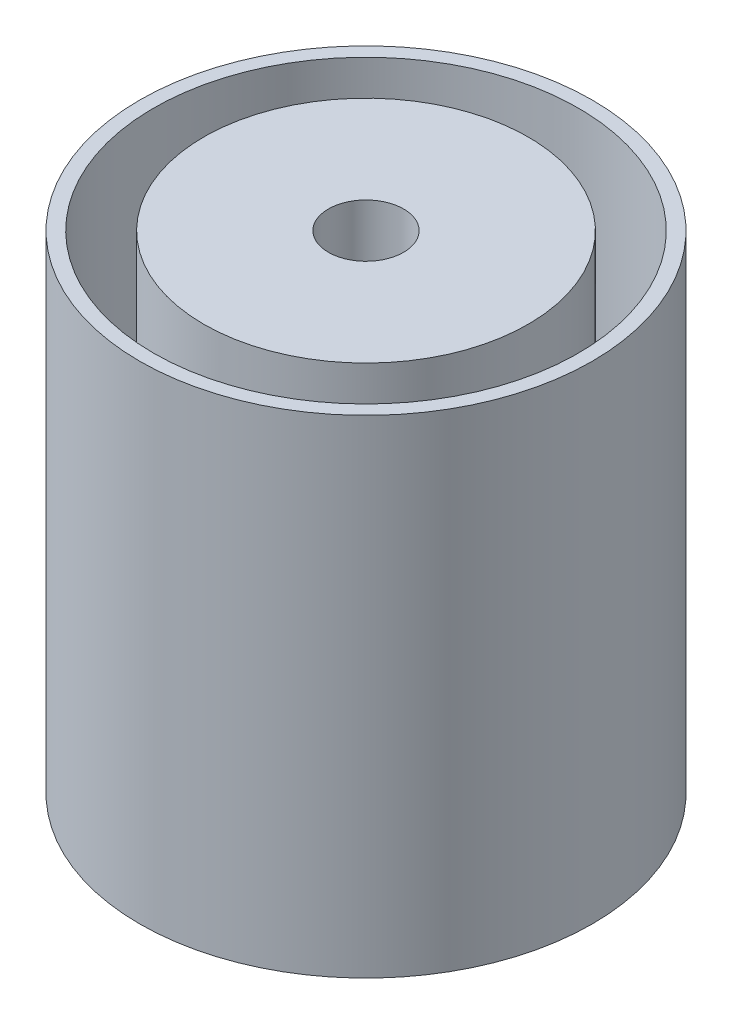
ISO-10303-21;
HEADER;
FILE_DESCRIPTION(('STEP AP214'),'2;1');
FILE_NAME('part.step','',(''),(''),'','','');
FILE_SCHEMA(('AUTOMOTIVE_DESIGN { 1 0 10303 214 1 1 1 1 }'));
ENDSEC;
DATA;
#1=APPLICATION_CONTEXT('core data for automotive mechanical design processes');
#2=APPLICATION_PROTOCOL_DEFINITION('international standard','automotive_design',2000,#1);
#3=PRODUCT_CONTEXT('',#1,'mechanical');
#4=PRODUCT('Part','Part','',(#3));
#5=PRODUCT_RELATED_PRODUCT_CATEGORY('part','',(#4));
#6=PRODUCT_DEFINITION_FORMATION('','',#4);
#7=PRODUCT_DEFINITION_CONTEXT('part definition',#1,'design');
#8=PRODUCT_DEFINITION('design','',#6,#7);
#9=PRODUCT_DEFINITION_SHAPE('','',#8);
#10=(LENGTH_UNIT() NAMED_UNIT(*) SI_UNIT(.MILLI.,.METRE.));
#11=(NAMED_UNIT(*) PLANE_ANGLE_UNIT() SI_UNIT($,.RADIAN.));
#12=(NAMED_UNIT(*) SI_UNIT($,.STERADIAN.) SOLID_ANGLE_UNIT());
#13=UNCERTAINTY_MEASURE_WITH_UNIT(LENGTH_MEASURE(1.E-05),#10,'distance_accuracy_value','');
#14=(GEOMETRIC_REPRESENTATION_CONTEXT(3) GLOBAL_UNCERTAINTY_ASSIGNED_CONTEXT((#13)) GLOBAL_UNIT_ASSIGNED_CONTEXT((#10,
#11,#12)) REPRESENTATION_CONTEXT('',''));
#15=CARTESIAN_POINT('',(0.,0.,0.));
#16=DIRECTION('',(0.,0.,1.));
#17=DIRECTION('',(1.,0.,0.));
#18=AXIS2_PLACEMENT_3D('',#15,#16,#17);
#19=CARTESIAN_POINT('',(0.,15.,0.));
#20=DIRECTION('',(0.,1.,0.));
#21=DIRECTION('',(0.,0.,1.));
#22=AXIS2_PLACEMENT_3D('',#19,#20,#21);
#23=PLANE('',#22);
#24=CARTESIAN_POINT('',(0.,15.,0.));
#25=DIRECTION('',(0.,1.,0.));
#26=DIRECTION('',(0.,0.,1.));
#27=AXIS2_PLACEMENT_3D('',#24,#25,#26);
#28=CIRCLE('',#27,15.25);
#29=CARTESIAN_POINT('',(0.,15.,15.25));
#30=VERTEX_POINT('',#29);
#31=EDGE_CURVE('E10',#30,#30,#28,.F.);
#32=ORIENTED_EDGE('',*,*,#31,.F.);
#33=EDGE_LOOP('',(#32));
#34=FACE_BOUND('',#33,.T.);
#35=CARTESIAN_POINT('',(0.,15.,0.));
#36=DIRECTION('',(0.,1.,0.));
#37=DIRECTION('',(0.,0.,1.));
#38=AXIS2_PLACEMENT_3D('',#35,#36,#37);
#39=CIRCLE('',#38,11.65);
#40=CARTESIAN_POINT('',(0.,15.,11.65));
#41=VERTEX_POINT('',#40);
#42=EDGE_CURVE('E53',#41,#41,#39,.T.);
#43=ORIENTED_EDGE('',*,*,#42,.F.);
#44=EDGE_LOOP('',(#43));
#45=FACE_BOUND('',#44,.T.);
#46=ADVANCED_FACE('F45',(#34,#45),#23,.T.);
#47=CARTESIAN_POINT('',(0.,35.,0.));
#48=DIRECTION('',(0.,-1.,0.));
#49=DIRECTION('',(0.,0.,-1.));
#50=AXIS2_PLACEMENT_3D('',#47,#48,#49);
#51=CYLINDRICAL_SURFACE('',#50,11.65);
#52=CARTESIAN_POINT('',(0.,35.,0.));
#53=DIRECTION('',(0.,1.,0.));
#54=DIRECTION('',(0.,0.,1.));
#55=AXIS2_PLACEMENT_3D('',#52,#53,#54);
#56=CIRCLE('',#55,11.65);
#57=CARTESIAN_POINT('',(0.,35.,11.65));
#58=VERTEX_POINT('',#57);
#59=EDGE_CURVE('E64',#58,#58,#56,.T.);
#60=ORIENTED_EDGE('',*,*,#59,.F.);
#61=EDGE_LOOP('',(#60));
#62=FACE_BOUND('',#61,.T.);
#63=ORIENTED_EDGE('',*,*,#42,.T.);
#64=EDGE_LOOP('',(#63));
#65=FACE_BOUND('',#64,.T.);
#66=ADVANCED_FACE('F98',(#62,#65),#51,.T.);
#67=CARTESIAN_POINT('',(0.,35.,0.));
#68=DIRECTION('',(0.,1.,0.));
#69=DIRECTION('',(0.,0.,1.));
#70=AXIS2_PLACEMENT_3D('',#67,#68,#69);
#71=PLANE('',#70);
#72=CARTESIAN_POINT('',(0.,35.,0.));
#73=DIRECTION('',(0.,1.,0.));
#74=DIRECTION('',(0.,0.,1.));
#75=AXIS2_PLACEMENT_3D('',#72,#73,#74);
#76=CIRCLE('',#75,2.7);
#77=CARTESIAN_POINT('',(0.,35.,2.7));
#78=VERTEX_POINT('',#77);
#79=EDGE_CURVE('E78',#78,#78,#76,.T.);
#80=ORIENTED_EDGE('',*,*,#79,.F.);
#81=EDGE_LOOP('',(#80));
#82=FACE_BOUND('',#81,.T.);
#83=ORIENTED_EDGE('',*,*,#59,.T.);
#84=EDGE_LOOP('',(#83));
#85=FACE_BOUND('',#84,.T.);
#86=ADVANCED_FACE('F94',(#82,#85),#71,.T.);
#87=CARTESIAN_POINT('',(0.,35.,0.));
#88=DIRECTION('',(0.,-1.,0.));
#89=DIRECTION('',(0.,0.,-1.));
#90=AXIS2_PLACEMENT_3D('',#87,#88,#89);
#91=CYLINDRICAL_SURFACE('',#90,15.25);
#92=CARTESIAN_POINT('',(0.,35.,0.));
#93=DIRECTION('',(0.,1.,0.));
#94=DIRECTION('',(0.,0.,1.));
#95=AXIS2_PLACEMENT_3D('',#92,#93,#94);
#96=CIRCLE('',#95,15.25);
#97=CARTESIAN_POINT('',(0.,35.,15.25));
#98=VERTEX_POINT('',#97);
#99=EDGE_CURVE('E73',#98,#98,#96,.T.);
#100=ORIENTED_EDGE('',*,*,#99,.T.);
#101=EDGE_LOOP('',(#100));
#102=FACE_BOUND('',#101,.T.);
#103=ORIENTED_EDGE('',*,*,#31,.T.);
#104=EDGE_LOOP('',(#103));
#105=FACE_BOUND('',#104,.T.);
#106=ADVANCED_FACE('F97',(#102,#105),#91,.F.);
#107=CARTESIAN_POINT('',(0.,35.,0.));
#108=DIRECTION('',(0.,1.,0.));
#109=DIRECTION('',(0.,0.,1.));
#110=AXIS2_PLACEMENT_3D('',#107,#108,#109);
#111=PLANE('',#110);
#112=ORIENTED_EDGE('',*,*,#99,.F.);
#113=EDGE_LOOP('',(#112));
#114=FACE_BOUND('',#113,.T.);
#115=CARTESIAN_POINT('',(0.,35.,0.));
#116=DIRECTION('',(0.,1.,0.));
#117=DIRECTION('',(0.,0.,1.));
#118=AXIS2_PLACEMENT_3D('',#115,#116,#117);
#119=CIRCLE('',#118,16.25);
#120=CARTESIAN_POINT('',(0.,35.,16.25));
#121=VERTEX_POINT('',#120);
#122=EDGE_CURVE('E69',#121,#121,#119,.T.);
#123=ORIENTED_EDGE('',*,*,#122,.T.);
#124=EDGE_LOOP('',(#123));
#125=FACE_BOUND('',#124,.T.);
#126=ADVANCED_FACE('F112',(#114,#125),#111,.T.);
#127=CARTESIAN_POINT('',(0.,0.,0.));
#128=DIRECTION('',(0.,1.,0.));
#129=DIRECTION('',(0.,0.,1.));
#130=AXIS2_PLACEMENT_3D('',#127,#128,#129);
#131=PLANE('',#130);
#132=CARTESIAN_POINT('',(0.,0.,0.));
#133=DIRECTION('',(0.,1.,0.));
#134=DIRECTION('',(0.,0.,1.));
#135=AXIS2_PLACEMENT_3D('',#132,#133,#134);
#136=CIRCLE('',#135,16.25);
#137=CARTESIAN_POINT('',(0.,0.,16.25));
#138=VERTEX_POINT('',#137);
#139=EDGE_CURVE('E58',#138,#138,#136,.T.);
#140=ORIENTED_EDGE('',*,*,#139,.F.);
#141=EDGE_LOOP('',(#140));
#142=FACE_BOUND('',#141,.T.);
#143=ADVANCED_FACE('F111',(#142),#131,.F.);
#144=CARTESIAN_POINT('',(0.,15.,0.));
#145=DIRECTION('',(0.,-1.,0.));
#146=DIRECTION('',(0.,0.,-1.));
#147=AXIS2_PLACEMENT_3D('',#144,#145,#146);
#148=CYLINDRICAL_SURFACE('',#147,16.25);
#149=ORIENTED_EDGE('',*,*,#139,.T.);
#150=EDGE_LOOP('',(#149));
#151=FACE_BOUND('',#150,.T.);
#152=ORIENTED_EDGE('',*,*,#122,.F.);
#153=EDGE_LOOP('',(#152));
#154=FACE_BOUND('',#153,.T.);
#155=ADVANCED_FACE('F47',(#151,#154),#148,.T.);
#156=CARTESIAN_POINT('',(0.,5.,0.));
#157=DIRECTION('',(0.,1.,0.));
#158=DIRECTION('',(0.,0.,1.));
#159=AXIS2_PLACEMENT_3D('',#156,#157,#158);
#160=CYLINDRICAL_SURFACE('',#159,2.7);
#161=CARTESIAN_POINT('',(0.,5.,0.));
#162=DIRECTION('',(0.,1.,0.));
#163=DIRECTION('',(0.,0.,1.));
#164=AXIS2_PLACEMENT_3D('',#161,#162,#163);
#165=CIRCLE('',#164,2.7);
#166=CARTESIAN_POINT('',(0.,5.,2.7));
#167=VERTEX_POINT('',#166);
#168=EDGE_CURVE('E77',#167,#167,#165,.T.);
#169=ORIENTED_EDGE('',*,*,#168,.F.);
#170=EDGE_LOOP('',(#169));
#171=FACE_BOUND('',#170,.T.);
#172=ORIENTED_EDGE('',*,*,#79,.T.);
#173=EDGE_LOOP('',(#172));
#174=FACE_BOUND('',#173,.T.);
#175=ADVANCED_FACE('F88',(#171,#174),#160,.F.);
#176=CARTESIAN_POINT('',(0.,5.,0.));
#177=DIRECTION('',(0.,1.,0.));
#178=DIRECTION('',(0.,0.,1.));
#179=AXIS2_PLACEMENT_3D('',#176,#177,#178);
#180=PLANE('',#179);
#181=ORIENTED_EDGE('',*,*,#168,.T.);
#182=EDGE_LOOP('',(#181));
#183=FACE_BOUND('',#182,.T.);
#184=ADVANCED_FACE('F86',(#183),#180,.T.);
#185=CLOSED_SHELL('',(#46,#66,#86,#106,#126,#143,#155,#175,#184));
#186=MANIFOLD_SOLID_BREP('B2',#185);
#187=ADVANCED_BREP_SHAPE_REPRESENTATION('',(#18,#186),#14);
#188=SHAPE_DEFINITION_REPRESENTATION(#9,#187);
ENDSEC;
END-ISO-10303-21;
